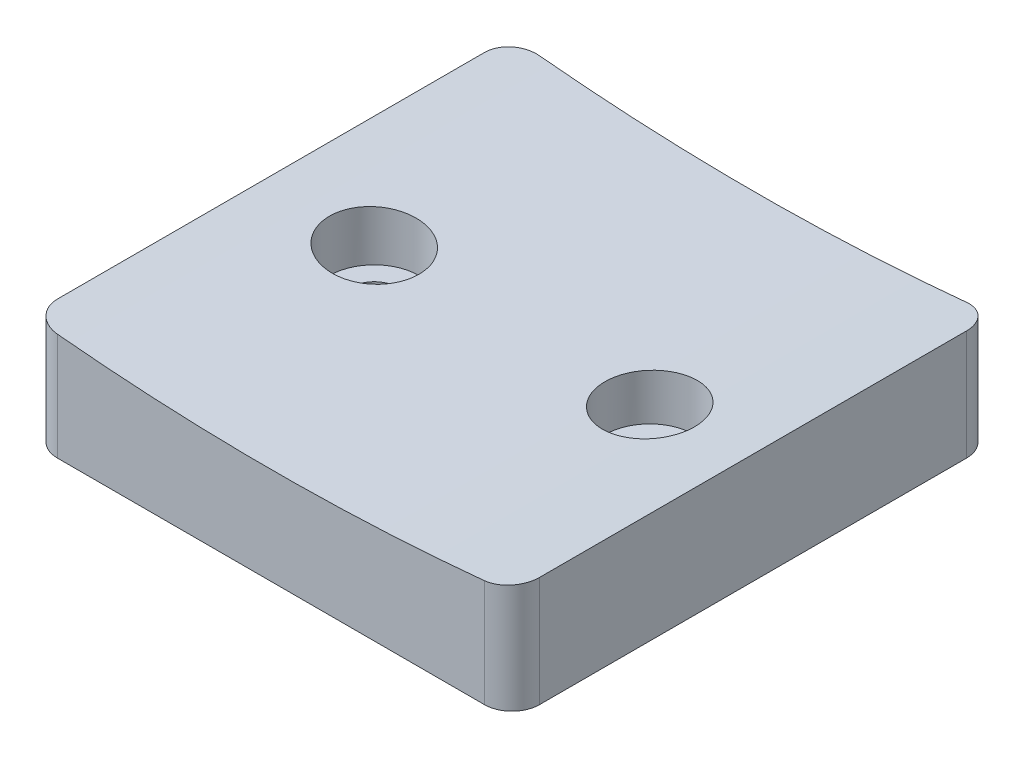
ISO-10303-21;
HEADER;
FILE_DESCRIPTION(('STEP AP214'),'2;1');
FILE_NAME('part.step','',(''),(''),'','','');
FILE_SCHEMA(('AUTOMOTIVE_DESIGN { 1 0 10303 214 1 1 1 1 }'));
ENDSEC;
DATA;
#1=APPLICATION_CONTEXT('core data for automotive mechanical design processes');
#2=APPLICATION_PROTOCOL_DEFINITION('international standard','automotive_design',2000,#1);
#3=PRODUCT_CONTEXT('',#1,'mechanical');
#4=PRODUCT('Part','Part','',(#3));
#5=PRODUCT_RELATED_PRODUCT_CATEGORY('part','',(#4));
#6=PRODUCT_DEFINITION_FORMATION('','',#4);
#7=PRODUCT_DEFINITION_CONTEXT('part definition',#1,'design');
#8=PRODUCT_DEFINITION('design','',#6,#7);
#9=PRODUCT_DEFINITION_SHAPE('','',#8);
#10=(LENGTH_UNIT() NAMED_UNIT(*) SI_UNIT(.MILLI.,.METRE.));
#11=(NAMED_UNIT(*) PLANE_ANGLE_UNIT() SI_UNIT($,.RADIAN.));
#12=(NAMED_UNIT(*) SI_UNIT($,.STERADIAN.) SOLID_ANGLE_UNIT());
#13=UNCERTAINTY_MEASURE_WITH_UNIT(LENGTH_MEASURE(1.E-05),#10,'distance_accuracy_value','');
#14=(GEOMETRIC_REPRESENTATION_CONTEXT(3) GLOBAL_UNCERTAINTY_ASSIGNED_CONTEXT((#13)) GLOBAL_UNIT_ASSIGNED_CONTEXT((#10,
#11,#12)) REPRESENTATION_CONTEXT('',''));
#15=CARTESIAN_POINT('',(0.,0.,0.));
#16=DIRECTION('',(0.,0.,1.));
#17=DIRECTION('',(1.,0.,0.));
#18=AXIS2_PLACEMENT_3D('',#15,#16,#17);
#19=CARTESIAN_POINT('',(15.5,8.,15.5));
#20=DIRECTION('',(0.,-1.,0.));
#21=DIRECTION('',(0.,0.,-1.));
#22=AXIS2_PLACEMENT_3D('',#19,#20,#21);
#23=CYLINDRICAL_SURFACE('',#22,1.99999999999999);
#24=CARTESIAN_POINT('',(15.5,7.79264032653007,17.5));
#25=CARTESIAN_POINT('',(15.5565057866021,7.79814002326773,17.4999994836325));
#26=CARTESIAN_POINT('',(15.6129814873523,7.80366752951754,17.4976038414292));
#27=CARTESIAN_POINT('',(15.7255237011321,7.81474239050137,17.4880472016339));
#28=CARTESIAN_POINT('',(15.7815902320139,7.82028974435349,17.4808864132203));
#29=CARTESIAN_POINT('',(15.9484891019268,7.83689165158967,17.4523226097502));
#30=CARTESIAN_POINT('',(16.058196288007,7.8479231501441,17.423837980361));
#31=CARTESIAN_POINT('',(16.271274279525,7.86956078999938,17.3487616579413));
#32=CARTESIAN_POINT('',(16.374641881821,7.88016671535429,17.3021608973965));
#33=CARTESIAN_POINT('',(16.5720880685648,7.90060408773028,17.1921548445033));
#34=CARTESIAN_POINT('',(16.6661685251381,7.91043569076002,17.128752948502));
#35=CARTESIAN_POINT('',(16.8421947768111,7.92896989766944,16.9870316347039));
#36=CARTESIAN_POINT('',(16.924160265975,7.93767433095462,16.9087369113355));
#37=CARTESIAN_POINT('',(17.0737867013196,7.95366156674305,16.7393405007457));
#38=CARTESIAN_POINT('',(17.141445038561,7.96094410994311,16.6482364827565));
#39=CARTESIAN_POINT('',(17.2601686326751,7.97378191376365,16.4562883228024));
#40=CARTESIAN_POINT('',(17.3113103275853,7.97934512603707,16.3554919354742));
#41=CARTESIAN_POINT('',(17.3959082814163,7.98857499458654,16.1466832237424));
#42=CARTESIAN_POINT('',(17.4293763649104,7.99224291887426,16.0386757785502));
#43=CARTESIAN_POINT('',(17.4689675167989,7.99658764998991,15.8582895336646));
#44=CARTESIAN_POINT('',(17.4805976062583,7.9978659262251,15.7870858132537));
#45=CARTESIAN_POINT('',(17.4961125667728,7.99957223650712,15.6439318129575));
#46=CARTESIAN_POINT('',(17.5000083895148,8.00000147278756,15.5719827339241));
#47=CARTESIAN_POINT('',(17.5,8.00000000000003,15.5));
#48=B_SPLINE_CURVE_WITH_KNOTS('',3,(#24,#25,#26,#27,#28,#29,#30,#31,#32,#33,#34,#35,#36,#37,#38,
#39,#40,#41,#42,#43,#44,#45,#46,#47),.UNSPECIFIED.,.F.,.F.,(4,2,2,2,2,2,2,2,2,2,2,4),(0.,
0.170213761128263,0.340420050779259,0.680310154276687,1.0203705995869,1.3603623540965,
1.69979519219368,2.03928987330962,2.37719009674131,2.71486395984944,2.93094617459352,
3.14672219903921),.UNSPECIFIED.);
#49=CARTESIAN_POINT('',(15.5,7.79264032653007,17.5));
#50=VERTEX_POINT('',#49);
#51=CARTESIAN_POINT('',(17.5,8.00000000000001,15.5));
#52=VERTEX_POINT('',#51);
#53=EDGE_CURVE('E200',#50,#52,#48,.T.);
#54=ORIENTED_EDGE('',*,*,#53,.F.);
#55=DIRECTION('',(0.,-1.,0.));
#56=VECTOR('',#55,1.);
#57=CARTESIAN_POINT('',(15.5,8.,17.5));
#58=LINE('',#57,#56);
#59=CARTESIAN_POINT('',(15.5,0.,17.5));
#60=VERTEX_POINT('',#59);
#61=EDGE_CURVE('E12',#50,#60,#58,.T.);
#62=ORIENTED_EDGE('',*,*,#61,.T.);
#63=CARTESIAN_POINT('',(15.5,0.,15.5));
#64=DIRECTION('',(0.,1.,0.));
#65=DIRECTION('',(0.,0.,1.));
#66=AXIS2_PLACEMENT_3D('',#63,#64,#65);
#67=CIRCLE('',#66,1.99999999999999);
#68=CARTESIAN_POINT('',(17.5,0.,15.5));
#69=VERTEX_POINT('',#68);
#70=EDGE_CURVE('E287',#60,#69,#67,.T.);
#71=ORIENTED_EDGE('',*,*,#70,.T.);
#72=DIRECTION('',(0.,-1.,0.));
#73=VECTOR('',#72,1.);
#74=CARTESIAN_POINT('',(17.5,8.,15.5));
#75=LINE('',#74,#73);
#76=EDGE_CURVE('E126',#52,#69,#75,.T.);
#77=ORIENTED_EDGE('',*,*,#76,.F.);
#78=EDGE_LOOP('',(#54,#62,#71,#77));
#79=FACE_BOUND('',#78,.T.);
#80=ADVANCED_FACE('F116',(#79),#23,.T.);
#81=CARTESIAN_POINT('',(15.5,8.,-15.5));
#82=DIRECTION('',(0.,-1.,0.));
#83=DIRECTION('',(0.,0.,-1.));
#84=AXIS2_PLACEMENT_3D('',#81,#82,#83);
#85=CYLINDRICAL_SURFACE('',#84,2.);
#86=CARTESIAN_POINT('',(17.5,8.00000000000001,-15.5));
#87=CARTESIAN_POINT('',(17.4999998090648,8.00000015034948,-15.5560325137001));
#88=CARTESIAN_POINT('',(17.4976437768043,7.99974071349522,-15.6120380888679));
#89=CARTESIAN_POINT('',(17.4882458250245,7.99870696348768,-15.7236464083239));
#90=CARTESIAN_POINT('',(17.4812041921672,7.99793268183228,-15.7792491770453));
#91=CARTESIAN_POINT('',(17.4531234144675,7.99484773272597,-15.9447382631841));
#92=CARTESIAN_POINT('',(17.4251281710838,7.99177492695962,-16.053512755686));
#93=CARTESIAN_POINT('',(17.3513914773666,7.9837138312586,-16.2647813548443));
#94=CARTESIAN_POINT('',(17.3056426534775,7.97872474544835,-16.3672728314817));
#95=CARTESIAN_POINT('',(17.197732453148,7.96702138186836,-16.5631061116926));
#96=CARTESIAN_POINT('',(17.1355730981273,7.96030731658121,-16.6564490402272));
#97=CARTESIAN_POINT('',(16.9964328486292,7.94538112397902,-16.8316303127118));
#98=CARTESIAN_POINT('',(16.9194107913098,7.93716483960671,-16.9134355874678));
#99=CARTESIAN_POINT('',(16.7528384833314,7.91953937957714,-17.0629857224174));
#100=CARTESIAN_POINT('',(16.6632856080772,7.91012995405384,-17.1307276296198));
#101=CARTESIAN_POINT('',(16.4736619596681,7.89038746053125,-17.2506116842167));
#102=CARTESIAN_POINT('',(16.3735339747041,7.88004941892385,-17.302662420006));
#103=CARTESIAN_POINT('',(16.1660295247263,7.85883932763831,-17.3891859308713));
#104=CARTESIAN_POINT('',(16.0586568824876,7.84796756040253,-17.4236678955457));
#105=CARTESIAN_POINT('',(15.8755726527628,7.82962580313084,-17.4658761457131));
#106=CARTESIAN_POINT('',(15.8009828588007,7.82220533417755,-17.4786637291441));
#107=CARTESIAN_POINT('',(15.6509406392864,7.8073860056605,-17.495724920755));
#108=CARTESIAN_POINT('',(15.5754895649874,7.79998713038979,-17.5000104026464));
#109=CARTESIAN_POINT('',(15.5,7.79264032653007,-17.5));
#110=B_SPLINE_CURVE_WITH_KNOTS('',3,(#86,#87,#88,#89,#90,#91,#92,#93,#94,#95,#96,#97,#98,#99,
#100,#101,#102,#103,#104,#105,#106,#107,#108,#109),.UNSPECIFIED.,.F.,.F.,(4,2,2,2,2,2,2,2,2,2,2,
4),(0.,0.167993969292738,0.33597766177109,0.671330804647426,1.00682337833441,1.34227464591684,
1.67866865052968,2.01513321904042,2.35352163691551,2.69173287368246,2.91940423732446,
3.14675741935432),.UNSPECIFIED.);
#111=CARTESIAN_POINT('',(17.5,8.00000000000001,-15.5));
#112=VERTEX_POINT('',#111);
#113=CARTESIAN_POINT('',(15.5,7.79264032653007,-17.5));
#114=VERTEX_POINT('',#113);
#115=EDGE_CURVE('E327',#112,#114,#110,.T.);
#116=ORIENTED_EDGE('',*,*,#115,.F.);
#117=DIRECTION('',(0.,-1.,0.));
#118=VECTOR('',#117,1.);
#119=CARTESIAN_POINT('',(17.5,8.,-15.5));
#120=LINE('',#119,#118);
#121=CARTESIAN_POINT('',(17.5,0.,-15.5));
#122=VERTEX_POINT('',#121);
#123=EDGE_CURVE('E221',#112,#122,#120,.T.);
#124=ORIENTED_EDGE('',*,*,#123,.T.);
#125=CARTESIAN_POINT('',(15.5,0.,-15.5));
#126=DIRECTION('',(0.,1.,0.));
#127=DIRECTION('',(0.,0.,1.));
#128=AXIS2_PLACEMENT_3D('',#125,#126,#127);
#129=CIRCLE('',#128,2.);
#130=CARTESIAN_POINT('',(15.5,0.,-17.5));
#131=VERTEX_POINT('',#130);
#132=EDGE_CURVE('E297',#122,#131,#129,.T.);
#133=ORIENTED_EDGE('',*,*,#132,.T.);
#134=DIRECTION('',(0.,-1.,0.));
#135=VECTOR('',#134,1.);
#136=CARTESIAN_POINT('',(15.5,8.,-17.5));
#137=LINE('',#136,#135);
#138=EDGE_CURVE('E218',#114,#131,#137,.T.);
#139=ORIENTED_EDGE('',*,*,#138,.F.);
#140=EDGE_LOOP('',(#116,#124,#133,#139));
#141=FACE_BOUND('',#140,.T.);
#142=ADVANCED_FACE('F266',(#141),#85,.T.);
#143=CARTESIAN_POINT('',(-5.,8.,-17.5));
#144=DIRECTION('',(0.,0.,1.));
#145=DIRECTION('',(1.,0.,0.));
#146=AXIS2_PLACEMENT_3D('',#143,#144,#145);
#147=PLANE('',#146);
#148=CARTESIAN_POINT('',(0.,167.040089285689,-17.5));
#149=DIRECTION('',(0.,0.,1.));
#150=DIRECTION('',(1.,0.,0.));
#151=AXIS2_PLACEMENT_3D('',#148,#149,#150);
#152=CIRCLE('',#151,160.);
#153=CARTESIAN_POINT('',(-15.5,7.79264032653007,-17.5));
#154=VERTEX_POINT('',#153);
#155=EDGE_CURVE('E325',#114,#154,#152,.F.);
#156=ORIENTED_EDGE('',*,*,#155,.F.);
#157=ORIENTED_EDGE('',*,*,#138,.T.);
#158=DIRECTION('',(-1.,0.,0.));
#159=VECTOR('',#158,1.);
#160=CARTESIAN_POINT('',(-5.,0.,-17.5));
#161=LINE('',#160,#159);
#162=CARTESIAN_POINT('',(-15.5,0.,-17.5));
#163=VERTEX_POINT('',#162);
#164=EDGE_CURVE('E307',#131,#163,#161,.T.);
#165=ORIENTED_EDGE('',*,*,#164,.T.);
#166=DIRECTION('',(0.,-1.,0.));
#167=VECTOR('',#166,1.);
#168=CARTESIAN_POINT('',(-15.5,8.,-17.5));
#169=LINE('',#168,#167);
#170=EDGE_CURVE('E211',#154,#163,#169,.T.);
#171=ORIENTED_EDGE('',*,*,#170,.F.);
#172=EDGE_LOOP('',(#156,#157,#165,#171));
#173=FACE_BOUND('',#172,.T.);
#174=ADVANCED_FACE('F271',(#173),#147,.F.);
#175=CARTESIAN_POINT('',(-15.5,8.,-15.5));
#176=DIRECTION('',(0.,-1.,0.));
#177=DIRECTION('',(0.,0.,-1.));
#178=AXIS2_PLACEMENT_3D('',#175,#176,#177);
#179=CYLINDRICAL_SURFACE('',#178,2.);
#180=CARTESIAN_POINT('',(-15.5,7.79264032653007,-17.5));
#181=CARTESIAN_POINT('',(-15.5565057866021,7.79814002326773,-17.4999994836325));
#182=CARTESIAN_POINT('',(-15.6129814873523,7.80366752951754,-17.4976038414292));
#183=CARTESIAN_POINT('',(-15.725523701132,7.81474239050137,-17.4880472016339));
#184=CARTESIAN_POINT('',(-15.7815902320139,7.82028974435349,-17.4808864132203));
#185=CARTESIAN_POINT('',(-15.9484891019268,7.83689165158967,-17.4523226097502));
#186=CARTESIAN_POINT('',(-16.0581962880069,7.8479231501441,-17.423837980361));
#187=CARTESIAN_POINT('',(-16.271274279525,7.86956078999938,-17.3487616579413));
#188=CARTESIAN_POINT('',(-16.374641881821,7.88016671535429,-17.3021608973965));
#189=CARTESIAN_POINT('',(-16.5720880685648,7.90060408773028,-17.1921548445033));
#190=CARTESIAN_POINT('',(-16.6661685251381,7.91043569076002,-17.128752948502));
#191=CARTESIAN_POINT('',(-16.8421947768111,7.92896989766944,-16.9870316347039));
#192=CARTESIAN_POINT('',(-16.924160265975,7.93767433095462,-16.9087369113356));
#193=CARTESIAN_POINT('',(-17.0737867013196,7.95366156674305,-16.7393405007457));
#194=CARTESIAN_POINT('',(-17.141445038561,7.96094410994311,-16.6482364827565));
#195=CARTESIAN_POINT('',(-17.2601686326751,7.97378191376365,-16.4562883228024));
#196=CARTESIAN_POINT('',(-17.3113103275852,7.97934512603707,-16.3554919354742));
#197=CARTESIAN_POINT('',(-17.3959082814163,7.98857499458654,-16.1466832237424));
#198=CARTESIAN_POINT('',(-17.4293763649104,7.99224291887426,-16.0386757785502));
#199=CARTESIAN_POINT('',(-17.4689675167989,7.99658764998991,-15.8582895336646));
#200=CARTESIAN_POINT('',(-17.4805976062583,7.9978659262251,-15.7870858132537));
#201=CARTESIAN_POINT('',(-17.4961125667728,7.99957223650712,-15.6439318129575));
#202=CARTESIAN_POINT('',(-17.5000083895148,8.00000147278756,-15.5719827339241));
#203=CARTESIAN_POINT('',(-17.5,8.00000000000003,-15.5));
#204=B_SPLINE_CURVE_WITH_KNOTS('',3,(#180,#181,#182,#183,#184,#185,#186,#187,#188,#189,#190,
#191,#192,#193,#194,#195,#196,#197,#198,#199,#200,#201,#202,#203),.UNSPECIFIED.,.F.,.F.,(4,2,2,
2,2,2,2,2,2,2,2,4),(0.,0.170213761128265,0.340420050779261,0.680310154276689,1.02037059958691,
1.3603623540965,1.69979519219369,2.03928987330964,2.37719009674132,2.71486395984945,
2.93094617459353,3.14672219903922),.UNSPECIFIED.);
#205=CARTESIAN_POINT('',(-17.5000000000001,8.00000000000001,-15.5));
#206=VERTEX_POINT('',#205);
#207=EDGE_CURVE('E185',#154,#206,#204,.T.);
#208=ORIENTED_EDGE('',*,*,#207,.F.);
#209=ORIENTED_EDGE('',*,*,#170,.T.);
#210=CARTESIAN_POINT('',(-15.5,0.,-15.5));
#211=DIRECTION('',(0.,1.,0.));
#212=DIRECTION('',(0.,0.,1.));
#213=AXIS2_PLACEMENT_3D('',#210,#211,#212);
#214=CIRCLE('',#213,2.);
#215=CARTESIAN_POINT('',(-17.5,0.,-15.5));
#216=VERTEX_POINT('',#215);
#217=EDGE_CURVE('E311',#163,#216,#214,.T.);
#218=ORIENTED_EDGE('',*,*,#217,.T.);
#219=DIRECTION('',(0.,-1.,0.));
#220=VECTOR('',#219,1.);
#221=CARTESIAN_POINT('',(-17.5,8.,-15.5));
#222=LINE('',#221,#220);
#223=EDGE_CURVE('E207',#206,#216,#222,.T.);
#224=ORIENTED_EDGE('',*,*,#223,.F.);
#225=EDGE_LOOP('',(#208,#209,#218,#224));
#226=FACE_BOUND('',#225,.T.);
#227=ADVANCED_FACE('F320',(#226),#179,.T.);
#228=CARTESIAN_POINT('',(-15.5,8.,15.5));
#229=DIRECTION('',(0.,-1.,0.));
#230=DIRECTION('',(0.,0.,-1.));
#231=AXIS2_PLACEMENT_3D('',#228,#229,#230);
#232=CYLINDRICAL_SURFACE('',#231,1.99999999999999);
#233=CARTESIAN_POINT('',(-17.5,8.00000000000001,15.5));
#234=CARTESIAN_POINT('',(-17.4999998090648,8.00000015034948,15.5560325137001));
#235=CARTESIAN_POINT('',(-17.4976437768043,7.99974071349522,15.6120380888679));
#236=CARTESIAN_POINT('',(-17.4882458250245,7.99870696348768,15.723646408324));
#237=CARTESIAN_POINT('',(-17.4812041921671,7.99793268183228,15.7792491770453));
#238=CARTESIAN_POINT('',(-17.4531234144675,7.99484773272597,15.9447382631841));
#239=CARTESIAN_POINT('',(-17.4251281710837,7.99177492695962,16.053512755686));
#240=CARTESIAN_POINT('',(-17.3513914773666,7.9837138312586,16.2647813548443));
#241=CARTESIAN_POINT('',(-17.3056426534774,7.97872474544835,16.3672728314817));
#242=CARTESIAN_POINT('',(-17.197732453148,7.96702138186836,16.5631061116926));
#243=CARTESIAN_POINT('',(-17.1355730981273,7.96030731658121,16.6564490402272));
#244=CARTESIAN_POINT('',(-16.9964328486292,7.94538112397903,16.8316303127118));
#245=CARTESIAN_POINT('',(-16.9194107913098,7.93716483960671,16.9134355874678));
#246=CARTESIAN_POINT('',(-16.7528384833314,7.91953937957715,17.0629857224174));
#247=CARTESIAN_POINT('',(-16.6632856080772,7.91012995405384,17.1307276296198));
#248=CARTESIAN_POINT('',(-16.4736619596681,7.89038746053124,17.2506116842167));
#249=CARTESIAN_POINT('',(-16.3735339747041,7.88004941892385,17.302662420006));
#250=CARTESIAN_POINT('',(-16.1660295247263,7.85883932763831,17.3891859308713));
#251=CARTESIAN_POINT('',(-16.0586568824876,7.84796756040253,17.4236678955457));
#252=CARTESIAN_POINT('',(-15.8755726527628,7.82962580313085,17.4658761457131));
#253=CARTESIAN_POINT('',(-15.8009828588007,7.82220533417755,17.4786637291441));
#254=CARTESIAN_POINT('',(-15.6509406392864,7.8073860056605,17.495724920755));
#255=CARTESIAN_POINT('',(-15.5754895649874,7.79998713038979,17.5000104026464));
#256=CARTESIAN_POINT('',(-15.5,7.79264032653007,17.5));
#257=B_SPLINE_CURVE_WITH_KNOTS('',3,(#233,#234,#235,#236,#237,#238,#239,#240,#241,#242,#243,
#244,#245,#246,#247,#248,#249,#250,#251,#252,#253,#254,#255,#256),.UNSPECIFIED.,.F.,.F.,(4,2,2,
2,2,2,2,2,2,2,2,4),(0.,0.167993969292736,0.335977661771089,0.671330804647424,1.00682337833441,
1.34227464591684,1.67866865052968,2.01513321904042,2.3535216369155,2.69173287368246,
2.91940423732445,3.14675741935431),.UNSPECIFIED.);
#258=CARTESIAN_POINT('',(-17.5000000000001,8.00000000000001,15.5));
#259=VERTEX_POINT('',#258);
#260=CARTESIAN_POINT('',(-15.5,7.79264032653007,17.5));
#261=VERTEX_POINT('',#260);
#262=EDGE_CURVE('E134',#259,#261,#257,.T.);
#263=ORIENTED_EDGE('',*,*,#262,.F.);
#264=DIRECTION('',(0.,-1.,0.));
#265=VECTOR('',#264,1.);
#266=CARTESIAN_POINT('',(-17.5,8.,15.5));
#267=LINE('',#266,#265);
#268=CARTESIAN_POINT('',(-17.5,0.,15.5));
#269=VERTEX_POINT('',#268);
#270=EDGE_CURVE('E197',#259,#269,#267,.T.);
#271=ORIENTED_EDGE('',*,*,#270,.T.);
#272=CARTESIAN_POINT('',(-15.5,0.,15.5));
#273=DIRECTION('',(0.,1.,0.));
#274=DIRECTION('',(0.,0.,1.));
#275=AXIS2_PLACEMENT_3D('',#272,#273,#274);
#276=CIRCLE('',#275,1.99999999999999);
#277=CARTESIAN_POINT('',(-15.5,0.,17.5));
#278=VERTEX_POINT('',#277);
#279=EDGE_CURVE('E285',#269,#278,#276,.T.);
#280=ORIENTED_EDGE('',*,*,#279,.T.);
#281=DIRECTION('',(0.,-1.,0.));
#282=VECTOR('',#281,1.);
#283=CARTESIAN_POINT('',(-15.5,8.,17.5));
#284=LINE('',#283,#282);
#285=EDGE_CURVE('E141',#261,#278,#284,.T.);
#286=ORIENTED_EDGE('',*,*,#285,.F.);
#287=EDGE_LOOP('',(#263,#271,#280,#286));
#288=FACE_BOUND('',#287,.T.);
#289=ADVANCED_FACE('F195',(#288),#232,.T.);
#290=CARTESIAN_POINT('',(5.,8.,17.5));
#291=DIRECTION('',(0.,0.,1.));
#292=DIRECTION('',(1.,0.,0.));
#293=AXIS2_PLACEMENT_3D('',#290,#291,#292);
#294=PLANE('',#293);
#295=ORIENTED_EDGE('',*,*,#61,.F.);
#296=CARTESIAN_POINT('',(0.,167.040089285689,17.5));
#297=DIRECTION('',(0.,0.,1.));
#298=DIRECTION('',(1.,0.,0.));
#299=AXIS2_PLACEMENT_3D('',#296,#297,#298);
#300=CIRCLE('',#299,160.);
#301=EDGE_CURVE('E201',#50,#261,#300,.F.);
#302=ORIENTED_EDGE('',*,*,#301,.T.);
#303=ORIENTED_EDGE('',*,*,#285,.T.);
#304=DIRECTION('',(-1.,0.,0.));
#305=VECTOR('',#304,1.);
#306=CARTESIAN_POINT('',(5.,0.,17.5));
#307=LINE('',#306,#305);
#308=EDGE_CURVE('E281',#60,#278,#307,.T.);
#309=ORIENTED_EDGE('',*,*,#308,.F.);
#310=EDGE_LOOP('',(#295,#302,#303,#309));
#311=FACE_BOUND('',#310,.T.);
#312=ADVANCED_FACE('F280',(#311),#294,.T.);
#313=CARTESIAN_POINT('',(-10.,8.,0.));
#314=DIRECTION('',(0.,-1.,0.));
#315=DIRECTION('',(0.,0.,-1.));
#316=AXIS2_PLACEMENT_3D('',#313,#314,#315);
#317=CYLINDRICAL_SURFACE('',#316,1.75);
#318=CARTESIAN_POINT('',(-10.,3.8529326676697,0.));
#319=DIRECTION('',(0.,-1.,0.));
#320=DIRECTION('',(0.,0.,-1.));
#321=AXIS2_PLACEMENT_3D('',#318,#319,#320);
#322=CIRCLE('',#321,1.75);
#323=CARTESIAN_POINT('',(-10.,3.8529326676697,-1.74999999999999));
#324=VERTEX_POINT('',#323);
#325=EDGE_CURVE('E120',#324,#324,#322,.T.);
#326=ORIENTED_EDGE('',*,*,#325,.F.);
#327=EDGE_LOOP('',(#326));
#328=FACE_BOUND('',#327,.T.);
#329=CARTESIAN_POINT('',(-10.,0.,0.));
#330=DIRECTION('',(0.,1.,0.));
#331=DIRECTION('',(0.,0.,1.));
#332=AXIS2_PLACEMENT_3D('',#329,#330,#331);
#333=CIRCLE('',#332,1.75);
#334=CARTESIAN_POINT('',(-10.,0.,1.75000000000001));
#335=VERTEX_POINT('',#334);
#336=EDGE_CURVE('E293',#335,#335,#333,.T.);
#337=ORIENTED_EDGE('',*,*,#336,.F.);
#338=EDGE_LOOP('',(#337));
#339=FACE_BOUND('',#338,.T.);
#340=ADVANCED_FACE('F358',(#328,#339),#317,.F.);
#341=CARTESIAN_POINT('',(10.,8.,0.));
#342=DIRECTION('',(0.,-1.,0.));
#343=DIRECTION('',(0.,0.,-1.));
#344=AXIS2_PLACEMENT_3D('',#341,#342,#343);
#345=CYLINDRICAL_SURFACE('',#344,1.75);
#346=CARTESIAN_POINT('',(10.,3.8529326676697,0.));
#347=DIRECTION('',(0.,-1.,0.));
#348=DIRECTION('',(0.,0.,-1.));
#349=AXIS2_PLACEMENT_3D('',#346,#347,#348);
#350=CIRCLE('',#349,1.75);
#351=CARTESIAN_POINT('',(10.,3.8529326676697,-1.74999999999998));
#352=VERTEX_POINT('',#351);
#353=EDGE_CURVE('E504',#352,#352,#350,.T.);
#354=ORIENTED_EDGE('',*,*,#353,.F.);
#355=EDGE_LOOP('',(#354));
#356=FACE_BOUND('',#355,.T.);
#357=CARTESIAN_POINT('',(10.,0.,0.));
#358=DIRECTION('',(0.,1.,0.));
#359=DIRECTION('',(0.,0.,1.));
#360=AXIS2_PLACEMENT_3D('',#357,#358,#359);
#361=CIRCLE('',#360,1.75);
#362=CARTESIAN_POINT('',(10.,0.,1.75000000000002));
#363=VERTEX_POINT('',#362);
#364=EDGE_CURVE('E300',#363,#363,#361,.T.);
#365=ORIENTED_EDGE('',*,*,#364,.F.);
#366=EDGE_LOOP('',(#365));
#367=FACE_BOUND('',#366,.T.);
#368=ADVANCED_FACE('F352',(#356,#367),#345,.F.);
#369=CARTESIAN_POINT('',(15.5,0.,15.5));
#370=DIRECTION('',(0.,1.,0.));
#371=DIRECTION('',(0.,0.,1.));
#372=AXIS2_PLACEMENT_3D('',#369,#370,#371);
#373=PLANE('',#372);
#374=ORIENTED_EDGE('',*,*,#70,.F.);
#375=ORIENTED_EDGE('',*,*,#308,.T.);
#376=ORIENTED_EDGE('',*,*,#279,.F.);
#377=DIRECTION('',(0.,0.,1.));
#378=VECTOR('',#377,1.);
#379=CARTESIAN_POINT('',(-17.5,0.,-15.5));
#380=LINE('',#379,#378);
#381=EDGE_CURVE('E205',#216,#269,#380,.T.);
#382=ORIENTED_EDGE('',*,*,#381,.F.);
#383=ORIENTED_EDGE('',*,*,#217,.F.);
#384=ORIENTED_EDGE('',*,*,#164,.F.);
#385=ORIENTED_EDGE('',*,*,#132,.F.);
#386=DIRECTION('',(0.,0.,-1.));
#387=VECTOR('',#386,1.);
#388=CARTESIAN_POINT('',(17.5,0.,15.5));
#389=LINE('',#388,#387);
#390=EDGE_CURVE('E291',#69,#122,#389,.T.);
#391=ORIENTED_EDGE('',*,*,#390,.F.);
#392=EDGE_LOOP('',(#374,#375,#376,#382,#383,#384,#385,#391));
#393=FACE_BOUND('',#392,.T.);
#394=ORIENTED_EDGE('',*,*,#336,.T.);
#395=EDGE_LOOP('',(#394));
#396=FACE_BOUND('',#395,.T.);
#397=ORIENTED_EDGE('',*,*,#364,.T.);
#398=EDGE_LOOP('',(#397));
#399=FACE_BOUND('',#398,.T.);
#400=ADVANCED_FACE('F288',(#393,#396,#399),#373,.F.);
#401=CARTESIAN_POINT('',(17.5,8.,15.5));
#402=DIRECTION('',(-1.,0.,0.));
#403=DIRECTION('',(0.,0.,1.));
#404=AXIS2_PLACEMENT_3D('',#401,#402,#403);
#405=PLANE('',#404);
#406=ORIENTED_EDGE('',*,*,#390,.T.);
#407=ORIENTED_EDGE('',*,*,#123,.F.);
#408=DIRECTION('',(0.,0.,-1.));
#409=VECTOR('',#408,1.);
#410=CARTESIAN_POINT('',(17.5,8.,15.5));
#411=LINE('',#410,#409);
#412=EDGE_CURVE('E191',#52,#112,#411,.T.);
#413=ORIENTED_EDGE('',*,*,#412,.F.);
#414=ORIENTED_EDGE('',*,*,#76,.T.);
#415=EDGE_LOOP('',(#406,#407,#413,#414));
#416=FACE_BOUND('',#415,.T.);
#417=ADVANCED_FACE('F330',(#416),#405,.F.);
#418=CARTESIAN_POINT('',(-17.5,8.,-15.5));
#419=DIRECTION('',(1.,0.,0.));
#420=DIRECTION('',(0.,0.,-1.));
#421=AXIS2_PLACEMENT_3D('',#418,#419,#420);
#422=PLANE('',#421);
#423=ORIENTED_EDGE('',*,*,#381,.T.);
#424=ORIENTED_EDGE('',*,*,#270,.F.);
#425=DIRECTION('',(0.,0.,1.));
#426=VECTOR('',#425,1.);
#427=CARTESIAN_POINT('',(-17.5,8.,-15.5));
#428=LINE('',#427,#426);
#429=EDGE_CURVE('E182',#206,#259,#428,.T.);
#430=ORIENTED_EDGE('',*,*,#429,.F.);
#431=ORIENTED_EDGE('',*,*,#223,.T.);
#432=EDGE_LOOP('',(#423,#424,#430,#431));
#433=FACE_BOUND('',#432,.T.);
#434=ADVANCED_FACE('F203',(#433),#422,.F.);
#435=CARTESIAN_POINT('',(0.,167.040089285689,80.1747556836084));
#436=DIRECTION('',(0.,0.,-1.));
#437=DIRECTION('',(-1.,0.,0.));
#438=AXIS2_PLACEMENT_3D('',#435,#436,#437);
#439=CYLINDRICAL_SURFACE('',#438,160.);
#440=CARTESIAN_POINT('',(-10.,7.3528950589761,-3.24999999999999));
#441=CARTESIAN_POINT('',(-10.1829456699373,7.3643520130032,-3.24999191406251));
#442=CARTESIAN_POINT('',(-10.3660043974228,7.37613415407553,-3.23450126591283));
#443=CARTESIAN_POINT('',(-10.7270431439094,7.39998345713131,-3.17293560154382));
#444=CARTESIAN_POINT('',(-10.9050167214844,7.41205094804804,-3.12682344509143));
#445=CARTESIAN_POINT('',(-11.2506093723013,7.43603614066654,-3.00532757766989));
#446=CARTESIAN_POINT('',(-11.4182333419703,7.4479539110425,-2.92995783345662));
#447=CARTESIAN_POINT('',(-11.7383982199989,7.47118315513418,-2.75209084474495));
#448=CARTESIAN_POINT('',(-11.8909429081662,7.48249478046042,-2.64960042218324));
#449=CARTESIAN_POINT('',(-12.1766348580948,7.50404283194829,-2.42039081225916));
#450=CARTESIAN_POINT('',(-12.3097857068451,7.51427945683871,-2.29367611535051));
#451=CARTESIAN_POINT('',(-12.5529149358764,7.5332266234683,-2.01957584335548));
#452=CARTESIAN_POINT('',(-12.6628926450413,7.54193712100814,-1.87218966980926));
#453=CARTESIAN_POINT('',(-12.8562790181139,7.55740836238048,-1.56128442011293));
#454=CARTESIAN_POINT('',(-12.9397475183972,7.56417349396284,-1.39780278399403));
#455=CARTESIAN_POINT('',(-13.0780405775162,7.57545465675208,-1.05907052017733));
#456=CARTESIAN_POINT('',(-13.1328657309558,7.57997073464672,-0.883820136870843));
#457=CARTESIAN_POINT('',(-13.212156259423,7.58652074218404,-0.527100219118269));
#458=CARTESIAN_POINT('',(-13.2367140154446,7.58856222437676,-0.345651354654293));
#459=CARTESIAN_POINT('',(-13.2550631886073,7.59008649706872,0.0188047040952821));
#460=CARTESIAN_POINT('',(-13.2488550582819,7.58956932520305,0.201811875420312));
#461=CARTESIAN_POINT('',(-13.2058922161606,7.58600541191875,0.563849749524503));
#462=CARTESIAN_POINT('',(-13.1691914310086,7.5829631361877,0.742886899854576));
#463=CARTESIAN_POINT('',(-13.0663749798839,7.57450527621235,1.09224566629738));
#464=CARTESIAN_POINT('',(-13.0002592192838,7.56908968433315,1.26256725437037));
#465=CARTESIAN_POINT('',(-12.8404462392929,7.55614231723117,1.58982818993497));
#466=CARTESIAN_POINT('',(-12.746725584456,7.5486087441758,1.74675602006598));
#467=CARTESIAN_POINT('',(-12.5344047363559,7.53178228850617,2.04265851712063));
#468=CARTESIAN_POINT('',(-12.4158041858074,7.52248938062733,2.18163292617958));
#469=CARTESIAN_POINT('',(-12.1567246601369,7.5025359240767,2.43810518474121));
#470=CARTESIAN_POINT('',(-12.0161849937155,7.49187159644683,2.55554143096891));
#471=CARTESIAN_POINT('',(-11.7174549550365,7.46965453543946,2.76516648557085));
#472=CARTESIAN_POINT('',(-11.559264293158,7.45810178748555,2.85735487958772));
#473=CARTESIAN_POINT('',(-11.2292378486277,7.434539166642,3.01412330362309));
#474=CARTESIAN_POINT('',(-11.0573654831752,7.42252811617178,3.07862615200764));
#475=CARTESIAN_POINT('',(-10.7052237254554,7.39852417854153,3.17783285302299));
#476=CARTESIAN_POINT('',(-10.5249542691049,7.38653129152084,3.2125364781989));
#477=CARTESIAN_POINT('',(-10.160922068081,7.36294953818933,3.25117558900415));
#478=CARTESIAN_POINT('',(-9.97715575963489,7.35136112238772,3.25507779177092));
#479=CARTESIAN_POINT('',(-9.61154085270913,7.32893804226692,3.23189604225265));
#480=CARTESIAN_POINT('',(-9.42969224895288,7.31810337587333,3.20481217524812));
#481=CARTESIAN_POINT('',(-9.07322894935027,7.29745758172336,3.12043525715107));
#482=CARTESIAN_POINT('',(-8.898608864286,7.2876456828447,3.06316516539366));
#483=CARTESIAN_POINT('',(-8.56144069927158,7.26922126754164,2.92003228918112));
#484=CARTESIAN_POINT('',(-8.39889251949666,7.26060874119892,2.83416974119437));
#485=CARTESIAN_POINT('',(-8.0907699114529,7.24471000410817,2.63643627985321));
#486=CARTESIAN_POINT('',(-7.94516853866229,7.23742167730714,2.52460752344722));
#487=CARTESIAN_POINT('',(-7.6748012230718,7.22420839498031,2.27803082561545));
#488=CARTESIAN_POINT('',(-7.55003512703723,7.21828342942745,2.1432830527641));
#489=CARTESIAN_POINT('',(-7.32507538926454,7.20781478782965,1.85490501791451));
#490=CARTESIAN_POINT('',(-7.22484649877191,7.20326912807606,1.70130232411967));
#491=CARTESIAN_POINT('',(-7.05159339341616,7.19553171847426,1.3794215668303));
#492=CARTESIAN_POINT('',(-6.97856901505994,7.19233996048937,1.21114359153846));
#493=CARTESIAN_POINT('',(-6.86186436596549,7.18728746374876,0.864847519033913));
#494=CARTESIAN_POINT('',(-6.8181585957154,7.18542556826938,0.68683803182277));
#495=CARTESIAN_POINT('',(-6.7612371858047,7.18300781651067,0.326000291720776));
#496=CARTESIAN_POINT('',(-6.74802152455302,7.18245195930649,0.143172042242344));
#497=CARTESIAN_POINT('',(-6.7524569899876,7.18263926103801,-0.222041962808673));
#498=CARTESIAN_POINT('',(-6.77009686023129,7.18338194625088,-0.404427855452361));
#499=CARTESIAN_POINT('',(-6.83571817247912,7.18617465998375,-0.763646887056668));
#500=CARTESIAN_POINT('',(-6.88369964840879,7.18822468996551,-0.940480019808408));
#501=CARTESIAN_POINT('',(-7.00863581305468,7.19365389308759,-1.28357795711567));
#502=CARTESIAN_POINT('',(-7.08559101165751,7.19703308961895,-1.44984257562373));
#503=CARTESIAN_POINT('',(-7.26627536637827,7.20514509460904,-1.76707933647211));
#504=CARTESIAN_POINT('',(-7.370003485342,7.20987785063309,-1.91805207088822));
#505=CARTESIAN_POINT('',(-7.60130497274464,7.22071144674933,-2.20047453208239));
#506=CARTESIAN_POINT('',(-7.72888444733886,7.22681263725276,-2.33191924401674));
#507=CARTESIAN_POINT('',(-8.00427507837326,7.24036918443287,-2.57155629548814));
#508=CARTESIAN_POINT('',(-8.15209129702779,7.24782488009162,-2.67974279953291));
#509=CARTESIAN_POINT('',(-8.4639095519711,7.26403780908336,-2.86990131934538));
#510=CARTESIAN_POINT('',(-8.62793305695133,7.27279677675112,-2.95183793770709));
#511=CARTESIAN_POINT('',(-8.96721391790626,7.29148108979529,-3.08692700705734));
#512=CARTESIAN_POINT('',(-9.14245768253957,7.30140503571983,-3.14011357251055));
#513=CARTESIAN_POINT('',(-9.43234012691439,7.31832017349617,-3.20207964541776));
#514=CARTESIAN_POINT('',(-9.5451183861127,7.32501918083534,-3.22002880565578));
#515=CARTESIAN_POINT('',(-9.77191644692521,7.33873500810825,-3.2439915053207));
#516=CARTESIAN_POINT('',(-9.8859362488819,7.34575182812966,-3.25000504145497));
#517=CARTESIAN_POINT('',(-10.,7.3528950589761,-3.24999999999999));
#518=B_SPLINE_CURVE_WITH_KNOTS('',3,(#440,#441,#442,#443,#444,#445,#446,#447,#448,#449,#450,
#451,#452,#453,#454,#455,#456,#457,#458,#459,#460,#461,#462,#463,#464,#465,#466,#467,#468,#469,
#470,#471,#472,#473,#474,#475,#476,#477,#478,#479,#480,#481,#482,#483,#484,#485,#486,#487,#488,
#489,#490,#491,#492,#493,#494,#495,#496,#497,#498,#499,#500,#501,#502,#503,#504,#505,#506,#507,
#508,#509,#510,#511,#512,#513,#514,#515,#516,#517),.UNSPECIFIED.,.T.,.F.,(4,2,2,2,2,2,2,2,2,2,2,
2,2,2,2,2,2,2,2,2,2,2,2,2,2,2,2,2,2,2,2,2,2,2,2,2,2,2,4),(0.,0.549494923239088,1.09965753845848,
1.64955784373168,2.1993199583268,2.74898026216324,3.29865648249915,3.84708301175067,
4.39549815582658,4.94223526951412,5.48896434130229,6.03472856884602,6.58049455211374,
7.12672521083513,7.6729637141866,8.22074099537234,8.76852726591487,9.31783088715414,
9.86713870114333,10.4170399954216,10.9669397762536,11.5164219111704,12.0658995018144,
12.6144911601171,13.1630787835813,13.7108736509649,14.2586652261692,14.8059797462819,
15.3532938788228,15.9004083866943,16.447523506306,16.9946482546325,17.541751811114,
18.0889956231603,18.6363765790351,19.1844925894228,19.7319567762763,20.074558133805,
20.4171595858452),.UNSPECIFIED.);
#519=CARTESIAN_POINT('',(-10.,7.3528950589761,-3.24999999999999));
#520=VERTEX_POINT('',#519);
#521=EDGE_CURVE('E237',#520,#520,#518,.T.);
#522=ORIENTED_EDGE('',*,*,#521,.F.);
#523=EDGE_LOOP('',(#522));
#524=FACE_BOUND('',#523,.T.);
#525=CARTESIAN_POINT('',(10.,7.3528950589761,-3.24999999999998));
#526=CARTESIAN_POINT('',(9.81734638537373,7.34145729275526,-3.24999197249731));
#527=CARTESIAN_POINT('',(9.63454200112578,7.33032717161023,-3.23455095032672));
#528=CARTESIAN_POINT('',(9.2739239157259,7.30898063195631,-3.17314391407832));
#529=CARTESIAN_POINT('',(9.0961163854773,7.29876531185676,-3.1271417481886));
#530=CARTESIAN_POINT('',(8.75076550649563,7.27947460071506,-3.00589032662998));
#531=CARTESIAN_POINT('',(8.58321802315256,7.27039874891891,-2.93065294320121));
#532=CARTESIAN_POINT('',(8.26315543516784,7.25352546137627,-2.75306411830179));
#533=CARTESIAN_POINT('',(8.11063659762607,7.24572770784766,-2.65071943330676));
#534=CARTESIAN_POINT('',(7.82509855564783,7.23149038746414,-2.42192793263186));
#535=CARTESIAN_POINT('',(7.69205821883659,7.22504934532307,-2.29550758472812));
#536=CARTESIAN_POINT('',(7.4490812441409,7.21353947933886,-2.02206977784526));
#537=CARTESIAN_POINT('',(7.33914535217289,7.20847069979707,-1.87505165413165));
#538=CARTESIAN_POINT('',(7.14565743210977,7.1997033290794,-1.56480295435911));
#539=CARTESIAN_POINT('',(7.06207132628056,7.19600296707062,-1.40159368037795));
#540=CARTESIAN_POINT('',(6.92347803251591,7.18993979582291,-1.06343846637612));
#541=CARTESIAN_POINT('',(6.86847066675894,7.18757697826156,-0.888492599390077));
#542=CARTESIAN_POINT('',(6.78863469851163,7.18416649479346,-0.531960732611249));
#543=CARTESIAN_POINT('',(6.76378521179956,7.18311791876274,-0.350379417706381));
#544=CARTESIAN_POINT('',(6.74490483224853,7.18232015204627,0.0143808228266101));
#545=CARTESIAN_POINT('',(6.75087382669702,7.18257095660831,0.197559742609362));
#546=CARTESIAN_POINT('',(6.79345464539179,7.18437491045307,0.560269476657911));
#547=CARTESIAN_POINT('',(6.83005914317922,7.18592774835562,0.739801152645882));
#548=CARTESIAN_POINT('',(6.93285669630449,7.19035321205843,1.09016638111992));
#549=CARTESIAN_POINT('',(6.99904976575072,7.193225838488,1.26099992945851));
#550=CARTESIAN_POINT('',(7.1591438657337,7.20031623851509,1.58914012905043));
#551=CARTESIAN_POINT('',(7.2530477323479,7.20453414980014,1.74644539361464));
#552=CARTESIAN_POINT('',(7.46588157012189,7.2143344070211,2.04305223637384));
#553=CARTESIAN_POINT('',(7.58481155912571,7.21991675392987,2.18235380173178));
#554=CARTESIAN_POINT('',(7.84437232120609,7.23244656234529,2.43907887747296));
#555=CARTESIAN_POINT('',(7.98501390391497,7.239394704319,2.556491425253));
#556=CARTESIAN_POINT('',(8.28394705564448,7.25461253088774,2.7660406487428));
#557=CARTESIAN_POINT('',(8.44223870357122,7.26288222139093,2.85817721144778));
#558=CARTESIAN_POINT('',(8.77214548961525,7.28065529482964,3.01467087219243));
#559=CARTESIAN_POINT('',(8.94377448158419,7.29015996764865,3.07899861687175));
#560=CARTESIAN_POINT('',(9.29533428009812,7.31023064902547,3.17793849699097));
#561=CARTESIAN_POINT('',(9.47526515797298,7.32079666670326,3.21255037706181));
#562=CARTESIAN_POINT('',(9.83861922350679,7.34276701097357,3.25113629848692));
#563=CARTESIAN_POINT('',(10.0220474547787,7.35417262882165,3.25506210902094));
#564=CARTESIAN_POINT('',(10.3869266487776,7.37749134441325,3.23205899225664));
#565=CARTESIAN_POINT('',(10.5683775909818,7.38940444741781,3.20512974501254));
#566=CARTESIAN_POINT('',(10.9244382457927,7.41337300147763,3.12112514630647));
#567=CARTESIAN_POINT('',(11.0990374145661,7.42542863742349,3.06400515054817));
#568=CARTESIAN_POINT('',(11.4361623538568,7.44922872323894,2.92120680344241));
#569=CARTESIAN_POINT('',(11.5986880667259,7.46097317162251,2.83552831574476));
#570=CARTESIAN_POINT('',(11.9070952156291,7.48368849149162,2.63799738343403));
#571=CARTESIAN_POINT('',(12.0529720109926,7.49465914696846,2.52613766751966));
#572=CARTESIAN_POINT('',(12.3238666069924,7.51535513602841,2.27940951382468));
#573=CARTESIAN_POINT('',(12.4488845495421,7.52508047808389,2.14454123259555));
#574=CARTESIAN_POINT('',(12.6742818683525,7.54283107360692,1.85585449159649));
#575=CARTESIAN_POINT('',(12.774702454603,7.55085916748207,1.70206838502992));
#576=CARTESIAN_POINT('',(12.9482813831774,7.56485727289186,1.37972589632071));
#577=CARTESIAN_POINT('',(13.0214402319393,7.57082732265839,1.21116978863053));
#578=CARTESIAN_POINT('',(13.1381954245006,7.58040389178019,0.864616540006728));
#579=CARTESIAN_POINT('',(13.181880342615,7.5840174915739,0.686649434927766));
#580=CARTESIAN_POINT('',(13.2387731254811,7.58873082711482,0.325876635186799));
#581=CARTESIAN_POINT('',(13.2519814285614,7.58983059901705,0.143071010152839));
#582=CARTESIAN_POINT('',(13.2475427080805,7.58946177017254,-0.221723307929937));
#583=CARTESIAN_POINT('',(13.229969409247,7.58799930621116,-0.403712909138244));
#584=CARTESIAN_POINT('',(13.1646197639034,7.58259072567758,-0.762146990947534));
#585=CARTESIAN_POINT('',(13.1168434428897,7.578644611202,-0.938591476229379));
#586=CARTESIAN_POINT('',(12.9924669174072,7.56846274850555,-1.28094156511156));
#587=CARTESIAN_POINT('',(12.9158661966669,7.56222695927456,-1.44684697988527));
#588=CARTESIAN_POINT('',(12.7360431465136,7.54776562741465,-1.76343661762973));
#589=CARTESIAN_POINT('',(12.632821544717,7.53954013916965,-1.91412125646645));
#590=CARTESIAN_POINT('',(12.4024349113196,7.52146042862953,-2.19637659670863));
#591=CARTESIAN_POINT('',(12.2752158738756,7.51160253887406,-2.32790297600563));
#592=CARTESIAN_POINT('',(12.0005619625079,7.49070683688283,-2.56778123500917));
#593=CARTESIAN_POINT('',(11.8531217667514,7.4796687142008,-2.67612699472721));
#594=CARTESIAN_POINT('',(11.5416934437117,7.45683904189895,-2.86690738999728));
#595=CARTESIAN_POINT('',(11.3776493720337,7.44504499778974,-2.94925029677006));
#596=CARTESIAN_POINT('',(11.0382065353387,7.42120937192683,-3.08512128312578));
#597=CARTESIAN_POINT('',(10.862821422368,7.40916809927809,-3.13868331071235));
#598=CARTESIAN_POINT('',(10.5719507981808,7.38970058081139,-3.2013458453036));
#599=CARTESIAN_POINT('',(10.4583528762942,7.38221769783701,-3.2195672288696));
#600=CARTESIAN_POINT('',(10.2298565450562,7.36741427497547,-3.24389684176347));
#601=CARTESIAN_POINT('',(10.114958133691,7.36009373533973,-3.25000505233211));
#602=CARTESIAN_POINT('',(10.,7.3528950589761,-3.24999999999998));
#603=B_SPLINE_CURVE_WITH_KNOTS('',3,(#525,#526,#527,#528,#529,#530,#531,#532,#533,#534,#535,
#536,#537,#538,#539,#540,#541,#542,#543,#544,#545,#546,#547,#548,#549,#550,#551,#552,#553,#554,
#555,#556,#557,#558,#559,#560,#561,#562,#563,#564,#565,#566,#567,#568,#569,#570,#571,#572,#573,
#574,#575,#576,#577,#578,#579,#580,#581,#582,#583,#584,#585,#586,#587,#588,#589,#590,#591,#592,
#593,#594,#595,#596,#597,#598,#599,#600,#601,#602),.UNSPECIFIED.,.T.,.F.,(4,2,2,2,2,2,2,2,2,2,2,
2,2,2,2,2,2,2,2,2,2,2,2,2,2,2,2,2,2,2,2,2,2,2,2,2,2,2,4),(0.,0.548614676843254,1.09787948689573,
1.64692147664172,2.19582674663417,2.7441320207151,3.29245499386277,3.84006589294353,
4.38767338466014,4.93490144339763,5.48212750075754,6.02922272677755,6.57631821366318,
7.12346971278128,7.67062160202844,8.21804678765458,8.76547442068918,9.31347848371426,
9.86148725607153,10.4103571881897,10.9592328117639,11.5089223603644,12.0586145334505,
12.6084595538425,13.1583008332091,13.7072145184022,14.2561180059809,14.8033645064414,
15.3506031361048,15.8965328712059,16.4424621454528,16.9884011982588,17.5343253307399,
18.08149304017,18.6288050312962,19.1780267163015,19.7265991460285,20.0718845203361,
20.4171704293744),.UNSPECIFIED.);
#604=CARTESIAN_POINT('',(10.,7.3528950589761,-3.24999999999998));
#605=VERTEX_POINT('',#604);
#606=EDGE_CURVE('E228',#605,#605,#603,.T.);
#607=ORIENTED_EDGE('',*,*,#606,.F.);
#608=EDGE_LOOP('',(#607));
#609=FACE_BOUND('',#608,.T.);
#610=ORIENTED_EDGE('',*,*,#412,.T.);
#611=ORIENTED_EDGE('',*,*,#115,.T.);
#612=ORIENTED_EDGE('',*,*,#155,.T.);
#613=ORIENTED_EDGE('',*,*,#207,.T.);
#614=ORIENTED_EDGE('',*,*,#429,.T.);
#615=ORIENTED_EDGE('',*,*,#262,.T.);
#616=ORIENTED_EDGE('',*,*,#301,.F.);
#617=ORIENTED_EDGE('',*,*,#53,.T.);
#618=EDGE_LOOP('',(#610,#611,#612,#613,#614,#615,#616,#617));
#619=FACE_BOUND('',#618,.T.);
#620=ADVANCED_FACE('F183',(#524,#609,#619),#439,.F.);
#621=CARTESIAN_POINT('',(10.,10.8529326676697,0.));
#622=DIRECTION('',(0.,-1.,0.));
#623=DIRECTION('',(0.,0.,-1.));
#624=AXIS2_PLACEMENT_3D('',#621,#622,#623);
#625=CYLINDRICAL_SURFACE('',#624,3.25);
#626=ORIENTED_EDGE('',*,*,#606,.T.);
#627=EDGE_LOOP('',(#626));
#628=FACE_BOUND('',#627,.T.);
#629=CARTESIAN_POINT('',(10.,3.8529326676697,0.));
#630=DIRECTION('',(0.,-1.,0.));
#631=DIRECTION('',(0.,0.,-1.));
#632=AXIS2_PLACEMENT_3D('',#629,#630,#631);
#633=CIRCLE('',#632,3.25);
#634=CARTESIAN_POINT('',(10.,3.8529326676697,-3.24999999999998));
#635=VERTEX_POINT('',#634);
#636=EDGE_CURVE('E494',#635,#635,#633,.T.);
#637=ORIENTED_EDGE('',*,*,#636,.T.);
#638=EDGE_LOOP('',(#637));
#639=FACE_BOUND('',#638,.T.);
#640=ADVANCED_FACE('F245',(#628,#639),#625,.F.);
#641=CARTESIAN_POINT('',(10.,3.8529326676697,0.));
#642=DIRECTION('',(0.,-1.,0.));
#643=DIRECTION('',(0.,0.,-1.));
#644=AXIS2_PLACEMENT_3D('',#641,#642,#643);
#645=PLANE('',#644);
#646=ORIENTED_EDGE('',*,*,#353,.T.);
#647=EDGE_LOOP('',(#646));
#648=FACE_BOUND('',#647,.T.);
#649=ORIENTED_EDGE('',*,*,#636,.F.);
#650=EDGE_LOOP('',(#649));
#651=FACE_BOUND('',#650,.T.);
#652=ADVANCED_FACE('F249',(#648,#651),#645,.F.);
#653=CARTESIAN_POINT('',(-10.,10.8529326676697,0.));
#654=DIRECTION('',(0.,-1.,0.));
#655=DIRECTION('',(0.,0.,-1.));
#656=AXIS2_PLACEMENT_3D('',#653,#654,#655);
#657=CYLINDRICAL_SURFACE('',#656,3.25);
#658=ORIENTED_EDGE('',*,*,#521,.T.);
#659=EDGE_LOOP('',(#658));
#660=FACE_BOUND('',#659,.T.);
#661=CARTESIAN_POINT('',(-10.,3.8529326676697,0.));
#662=DIRECTION('',(0.,-1.,0.));
#663=DIRECTION('',(0.,0.,-1.));
#664=AXIS2_PLACEMENT_3D('',#661,#662,#663);
#665=CIRCLE('',#664,3.25);
#666=CARTESIAN_POINT('',(-10.,3.8529326676697,-3.24999999999999));
#667=VERTEX_POINT('',#666);
#668=EDGE_CURVE('E238',#667,#667,#665,.T.);
#669=ORIENTED_EDGE('',*,*,#668,.T.);
#670=EDGE_LOOP('',(#669));
#671=FACE_BOUND('',#670,.T.);
#672=ADVANCED_FACE('F252',(#660,#671),#657,.F.);
#673=CARTESIAN_POINT('',(-10.,3.8529326676697,0.));
#674=DIRECTION('',(0.,-1.,0.));
#675=DIRECTION('',(0.,0.,-1.));
#676=AXIS2_PLACEMENT_3D('',#673,#674,#675);
#677=PLANE('',#676);
#678=ORIENTED_EDGE('',*,*,#325,.T.);
#679=EDGE_LOOP('',(#678));
#680=FACE_BOUND('',#679,.T.);
#681=ORIENTED_EDGE('',*,*,#668,.F.);
#682=EDGE_LOOP('',(#681));
#683=FACE_BOUND('',#682,.T.);
#684=ADVANCED_FACE('F257',(#680,#683),#677,.F.);
#685=CLOSED_SHELL('',(#80,#142,#174,#227,#289,#312,#340,#368,#400,#417,#434,#620,#640,#652,#672,#684));
#686=MANIFOLD_SOLID_BREP('B2',#685);
#687=ADVANCED_BREP_SHAPE_REPRESENTATION('',(#18,#686),#14);
#688=SHAPE_DEFINITION_REPRESENTATION(#9,#687);
ENDSEC;
END-ISO-10303-21;
